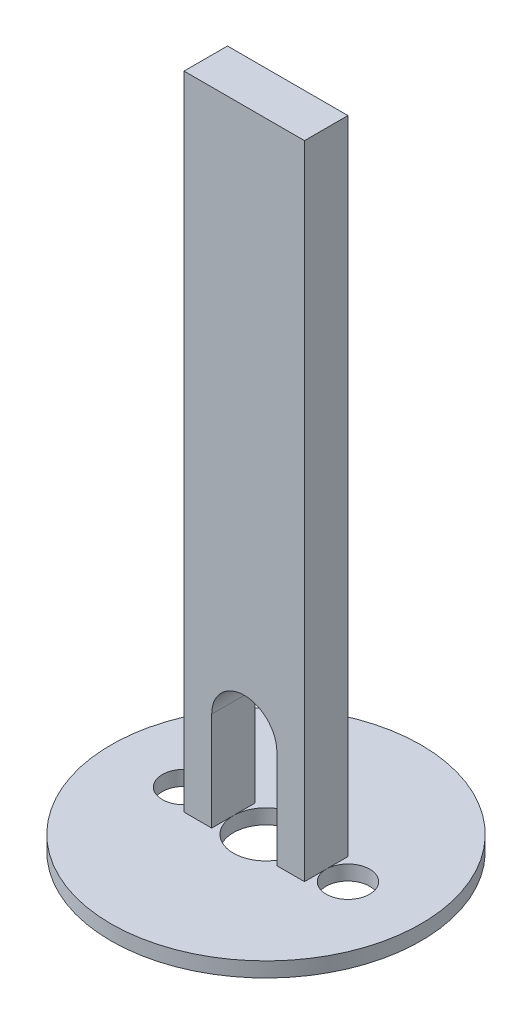
ISO-10303-21;
HEADER;
FILE_DESCRIPTION(('STEP AP214'),'2;1');
FILE_NAME('part.step','',(''),(''),'','','');
FILE_SCHEMA(('AUTOMOTIVE_DESIGN { 1 0 10303 214 1 1 1 1 }'));
ENDSEC;
DATA;
#1=APPLICATION_CONTEXT('core data for automotive mechanical design processes');
#2=APPLICATION_PROTOCOL_DEFINITION('international standard','automotive_design',2000,#1);
#3=PRODUCT_CONTEXT('',#1,'mechanical');
#4=PRODUCT('Part','Part','',(#3));
#5=PRODUCT_RELATED_PRODUCT_CATEGORY('part','',(#4));
#6=PRODUCT_DEFINITION_FORMATION('','',#4);
#7=PRODUCT_DEFINITION_CONTEXT('part definition',#1,'design');
#8=PRODUCT_DEFINITION('design','',#6,#7);
#9=PRODUCT_DEFINITION_SHAPE('','',#8);
#10=(LENGTH_UNIT() NAMED_UNIT(*) SI_UNIT(.MILLI.,.METRE.));
#11=(NAMED_UNIT(*) PLANE_ANGLE_UNIT() SI_UNIT($,.RADIAN.));
#12=(NAMED_UNIT(*) SI_UNIT($,.STERADIAN.) SOLID_ANGLE_UNIT());
#13=UNCERTAINTY_MEASURE_WITH_UNIT(LENGTH_MEASURE(1.E-05),#10,'distance_accuracy_value','');
#14=(GEOMETRIC_REPRESENTATION_CONTEXT(3) GLOBAL_UNCERTAINTY_ASSIGNED_CONTEXT((#13)) GLOBAL_UNIT_ASSIGNED_CONTEXT((#10,
#11,#12)) REPRESENTATION_CONTEXT('',''));
#15=CARTESIAN_POINT('',(0.,0.,0.));
#16=DIRECTION('',(0.,0.,1.));
#17=DIRECTION('',(1.,0.,0.));
#18=AXIS2_PLACEMENT_3D('',#15,#16,#17);
#19=CARTESIAN_POINT('',(0.,1.5,0.));
#20=DIRECTION('',(0.,1.,0.));
#21=DIRECTION('',(0.,0.,1.));
#22=AXIS2_PLACEMENT_3D('',#19,#20,#21);
#23=PLANE('',#22);
#24=DIRECTION('',(-1.,0.,0.));
#25=VECTOR('',#24,1.);
#26=CARTESIAN_POINT('',(-6.1,1.5,-2.2));
#27=LINE('',#26,#25);
#28=CARTESIAN_POINT('',(-3.3,1.5,-2.2));
#29=VERTEX_POINT('',#28);
#30=CARTESIAN_POINT('',(-6.1,1.5,-2.2));
#31=VERTEX_POINT('',#30);
#32=EDGE_CURVE('E149',#29,#31,#27,.T.);
#33=ORIENTED_EDGE('',*,*,#32,.F.);
#34=DIRECTION('',(0.,0.,-1.));
#35=VECTOR('',#34,1.);
#36=CARTESIAN_POINT('',(-3.3,1.5,15.7));
#37=LINE('',#36,#35);
#38=CARTESIAN_POINT('',(-3.3,1.5,0.));
#39=VERTEX_POINT('',#38);
#40=EDGE_CURVE('E120',#39,#29,#37,.T.);
#41=ORIENTED_EDGE('',*,*,#40,.F.);
#42=CARTESIAN_POINT('',(0.,1.5,0.));
#43=DIRECTION('',(0.,1.,0.));
#44=DIRECTION('',(0.,0.,1.));
#45=AXIS2_PLACEMENT_3D('',#42,#43,#44);
#46=CIRCLE('',#45,3.3);
#47=CARTESIAN_POINT('',(3.3,1.5,0.));
#48=VERTEX_POINT('',#47);
#49=EDGE_CURVE('E115',#48,#39,#46,.T.);
#50=ORIENTED_EDGE('',*,*,#49,.F.);
#51=DIRECTION('',(0.,0.,-1.));
#52=VECTOR('',#51,1.);
#53=CARTESIAN_POINT('',(3.3,1.5,15.7));
#54=LINE('',#53,#52);
#55=CARTESIAN_POINT('',(3.3,1.5,-2.2));
#56=VERTEX_POINT('',#55);
#57=EDGE_CURVE('E118',#48,#56,#54,.T.);
#58=ORIENTED_EDGE('',*,*,#57,.T.);
#59=CARTESIAN_POINT('',(6.1,1.5,-2.2));
#60=VERTEX_POINT('',#59);
#61=EDGE_CURVE('E188',#60,#56,#27,.T.);
#62=ORIENTED_EDGE('',*,*,#61,.F.);
#63=DIRECTION('',(0.,0.,-1.));
#64=VECTOR('',#63,1.);
#65=CARTESIAN_POINT('',(6.1,1.5,2.2));
#66=LINE('',#65,#64);
#67=CARTESIAN_POINT('',(6.1,1.5,0.));
#68=VERTEX_POINT('',#67);
#69=EDGE_CURVE('E189',#68,#60,#66,.T.);
#70=ORIENTED_EDGE('',*,*,#69,.F.);
#71=CARTESIAN_POINT('',(8.3,1.5,0.));
#72=DIRECTION('',(0.,1.,0.));
#73=DIRECTION('',(0.,0.,1.));
#74=AXIS2_PLACEMENT_3D('',#71,#72,#73);
#75=CIRCLE('',#74,2.2);
#76=EDGE_CURVE('E208',#68,#68,#75,.T.);
#77=ORIENTED_EDGE('',*,*,#76,.F.);
#78=CARTESIAN_POINT('',(6.1,1.5,2.2));
#79=VERTEX_POINT('',#78);
#80=EDGE_CURVE('E174',#79,#68,#66,.T.);
#81=ORIENTED_EDGE('',*,*,#80,.F.);
#82=DIRECTION('',(1.,0.,0.));
#83=VECTOR('',#82,1.);
#84=CARTESIAN_POINT('',(-6.1,1.5,2.2));
#85=LINE('',#84,#83);
#86=CARTESIAN_POINT('',(3.3,1.5,2.2));
#87=VERTEX_POINT('',#86);
#88=EDGE_CURVE('E58',#87,#79,#85,.T.);
#89=ORIENTED_EDGE('',*,*,#88,.F.);
#90=EDGE_CURVE('E51',#87,#48,#54,.T.);
#91=ORIENTED_EDGE('',*,*,#90,.T.);
#92=EDGE_CURVE('E125',#39,#48,#46,.T.);
#93=ORIENTED_EDGE('',*,*,#92,.F.);
#94=CARTESIAN_POINT('',(-3.3,1.5,2.2));
#95=VERTEX_POINT('',#94);
#96=EDGE_CURVE('E166',#95,#39,#37,.T.);
#97=ORIENTED_EDGE('',*,*,#96,.F.);
#98=CARTESIAN_POINT('',(-6.1,1.5,2.2));
#99=VERTEX_POINT('',#98);
#100=EDGE_CURVE('E179',#99,#95,#85,.T.);
#101=ORIENTED_EDGE('',*,*,#100,.F.);
#102=DIRECTION('',(0.,0.,1.));
#103=VECTOR('',#102,1.);
#104=CARTESIAN_POINT('',(-6.1,1.5,2.2));
#105=LINE('',#104,#103);
#106=CARTESIAN_POINT('',(-6.1,1.5,0.));
#107=VERTEX_POINT('',#106);
#108=EDGE_CURVE('E194',#107,#99,#105,.T.);
#109=ORIENTED_EDGE('',*,*,#108,.F.);
#110=CARTESIAN_POINT('',(-8.3,1.5,0.));
#111=DIRECTION('',(0.,1.,0.));
#112=DIRECTION('',(0.,0.,1.));
#113=AXIS2_PLACEMENT_3D('',#110,#111,#112);
#114=CIRCLE('',#113,2.2);
#115=EDGE_CURVE('E147',#107,#107,#114,.T.);
#116=ORIENTED_EDGE('',*,*,#115,.F.);
#117=EDGE_CURVE('E191',#31,#107,#105,.T.);
#118=ORIENTED_EDGE('',*,*,#117,.F.);
#119=EDGE_LOOP('',(#33,#41,#50,#58,#62,#70,#77,#81,#89,#91,#93,#97,#101,#109,#116,#118));
#120=FACE_BOUND('',#119,.T.);
#121=CARTESIAN_POINT('',(0.,1.5,0.));
#122=DIRECTION('',(0.,1.,0.));
#123=DIRECTION('',(0.,0.,1.));
#124=AXIS2_PLACEMENT_3D('',#121,#122,#123);
#125=CIRCLE('',#124,15.7);
#126=CARTESIAN_POINT('',(0.,1.5,15.7));
#127=VERTEX_POINT('',#126);
#128=EDGE_CURVE('E139',#127,#127,#125,.T.);
#129=ORIENTED_EDGE('',*,*,#128,.T.);
#130=EDGE_LOOP('',(#129));
#131=FACE_BOUND('',#130,.T.);
#132=ADVANCED_FACE('F36',(#120,#131),#23,.T.);
#133=CARTESIAN_POINT('',(0.,0.,0.));
#134=DIRECTION('',(0.,1.,0.));
#135=DIRECTION('',(0.,0.,1.));
#136=AXIS2_PLACEMENT_3D('',#133,#134,#135);
#137=PLANE('',#136);
#138=CARTESIAN_POINT('',(0.,0.,0.));
#139=DIRECTION('',(0.,1.,0.));
#140=DIRECTION('',(0.,0.,1.));
#141=AXIS2_PLACEMENT_3D('',#138,#139,#140);
#142=CIRCLE('',#141,15.7);
#143=CARTESIAN_POINT('',(0.,0.,15.7));
#144=VERTEX_POINT('',#143);
#145=EDGE_CURVE('E137',#144,#144,#142,.T.);
#146=ORIENTED_EDGE('',*,*,#145,.F.);
#147=EDGE_LOOP('',(#146));
#148=FACE_BOUND('',#147,.T.);
#149=CARTESIAN_POINT('',(0.,0.,0.));
#150=DIRECTION('',(0.,1.,0.));
#151=DIRECTION('',(0.,0.,1.));
#152=AXIS2_PLACEMENT_3D('',#149,#150,#151);
#153=CIRCLE('',#152,3.3);
#154=CARTESIAN_POINT('',(0.,0.,3.3));
#155=VERTEX_POINT('',#154);
#156=EDGE_CURVE('E126',#155,#155,#153,.T.);
#157=ORIENTED_EDGE('',*,*,#156,.T.);
#158=EDGE_LOOP('',(#157));
#159=FACE_BOUND('',#158,.T.);
#160=CARTESIAN_POINT('',(-8.3,0.,0.));
#161=DIRECTION('',(0.,1.,0.));
#162=DIRECTION('',(0.,0.,1.));
#163=AXIS2_PLACEMENT_3D('',#160,#161,#162);
#164=CIRCLE('',#163,2.2);
#165=CARTESIAN_POINT('',(-8.3,0.,2.2));
#166=VERTEX_POINT('',#165);
#167=EDGE_CURVE('E143',#166,#166,#164,.T.);
#168=ORIENTED_EDGE('',*,*,#167,.T.);
#169=EDGE_LOOP('',(#168));
#170=FACE_BOUND('',#169,.T.);
#171=CARTESIAN_POINT('',(8.3,0.,0.));
#172=DIRECTION('',(0.,1.,0.));
#173=DIRECTION('',(0.,0.,1.));
#174=AXIS2_PLACEMENT_3D('',#171,#172,#173);
#175=CIRCLE('',#174,2.2);
#176=CARTESIAN_POINT('',(8.3,0.,2.2));
#177=VERTEX_POINT('',#176);
#178=EDGE_CURVE('E207',#177,#177,#175,.T.);
#179=ORIENTED_EDGE('',*,*,#178,.T.);
#180=EDGE_LOOP('',(#179));
#181=FACE_BOUND('',#180,.T.);
#182=ADVANCED_FACE('F218',(#148,#159,#170,#181),#137,.F.);
#183=CARTESIAN_POINT('',(0.,1.5,0.));
#184=DIRECTION('',(0.,-1.,0.));
#185=DIRECTION('',(0.,0.,-1.));
#186=AXIS2_PLACEMENT_3D('',#183,#184,#185);
#187=CYLINDRICAL_SURFACE('',#186,15.7);
#188=ORIENTED_EDGE('',*,*,#128,.F.);
#189=EDGE_LOOP('',(#188));
#190=FACE_BOUND('',#189,.T.);
#191=ORIENTED_EDGE('',*,*,#145,.T.);
#192=EDGE_LOOP('',(#191));
#193=FACE_BOUND('',#192,.T.);
#194=ADVANCED_FACE('F38',(#190,#193),#187,.T.);
#195=CARTESIAN_POINT('',(0.,1.5,0.));
#196=DIRECTION('',(0.,-1.,0.));
#197=DIRECTION('',(0.,0.,-1.));
#198=AXIS2_PLACEMENT_3D('',#195,#196,#197);
#199=CYLINDRICAL_SURFACE('',#198,3.3);
#200=ORIENTED_EDGE('',*,*,#92,.T.);
#201=ORIENTED_EDGE('',*,*,#49,.T.);
#202=EDGE_LOOP('',(#200,#201));
#203=FACE_BOUND('',#202,.T.);
#204=ORIENTED_EDGE('',*,*,#156,.F.);
#205=EDGE_LOOP('',(#204));
#206=FACE_BOUND('',#205,.T.);
#207=ADVANCED_FACE('F135',(#203,#206),#199,.F.);
#208=CARTESIAN_POINT('',(-8.3,1.5,0.));
#209=DIRECTION('',(0.,-1.,0.));
#210=DIRECTION('',(0.,0.,-1.));
#211=AXIS2_PLACEMENT_3D('',#208,#209,#210);
#212=CYLINDRICAL_SURFACE('',#211,2.2);
#213=ORIENTED_EDGE('',*,*,#115,.T.);
#214=EDGE_LOOP('',(#213));
#215=FACE_BOUND('',#214,.T.);
#216=ORIENTED_EDGE('',*,*,#167,.F.);
#217=EDGE_LOOP('',(#216));
#218=FACE_BOUND('',#217,.T.);
#219=ADVANCED_FACE('F221',(#215,#218),#212,.F.);
#220=CARTESIAN_POINT('',(8.3,1.5,0.));
#221=DIRECTION('',(0.,-1.,0.));
#222=DIRECTION('',(0.,0.,-1.));
#223=AXIS2_PLACEMENT_3D('',#220,#221,#222);
#224=CYLINDRICAL_SURFACE('',#223,2.2);
#225=ORIENTED_EDGE('',*,*,#76,.T.);
#226=EDGE_LOOP('',(#225));
#227=FACE_BOUND('',#226,.T.);
#228=ORIENTED_EDGE('',*,*,#178,.F.);
#229=EDGE_LOOP('',(#228));
#230=FACE_BOUND('',#229,.T.);
#231=ADVANCED_FACE('F223',(#227,#230),#224,.F.);
#232=CARTESIAN_POINT('',(6.1,66.5,2.2));
#233=DIRECTION('',(-1.,0.,0.));
#234=DIRECTION('',(0.,0.,1.));
#235=AXIS2_PLACEMENT_3D('',#232,#233,#234);
#236=PLANE('',#235);
#237=ORIENTED_EDGE('',*,*,#80,.T.);
#238=ORIENTED_EDGE('',*,*,#69,.T.);
#239=DIRECTION('',(0.,-1.,0.));
#240=VECTOR('',#239,1.);
#241=CARTESIAN_POINT('',(6.1,66.5,-2.2));
#242=LINE('',#241,#240);
#243=CARTESIAN_POINT('',(6.1,66.5,-2.2));
#244=VERTEX_POINT('',#243);
#245=EDGE_CURVE('E204',#244,#60,#242,.T.);
#246=ORIENTED_EDGE('',*,*,#245,.F.);
#247=DIRECTION('',(0.,0.,-1.));
#248=VECTOR('',#247,1.);
#249=CARTESIAN_POINT('',(6.1,66.5,2.2));
#250=LINE('',#249,#248);
#251=CARTESIAN_POINT('',(6.1,66.5,2.2));
#252=VERTEX_POINT('',#251);
#253=EDGE_CURVE('E175',#252,#244,#250,.T.);
#254=ORIENTED_EDGE('',*,*,#253,.F.);
#255=DIRECTION('',(0.,-1.,0.));
#256=VECTOR('',#255,1.);
#257=CARTESIAN_POINT('',(6.1,66.5,2.2));
#258=LINE('',#257,#256);
#259=EDGE_CURVE('E185',#252,#79,#258,.T.);
#260=ORIENTED_EDGE('',*,*,#259,.T.);
#261=EDGE_LOOP('',(#237,#238,#246,#254,#260));
#262=FACE_BOUND('',#261,.T.);
#263=ADVANCED_FACE('F229',(#262),#236,.F.);
#264=CARTESIAN_POINT('',(-6.1,66.5,-2.2));
#265=DIRECTION('',(0.,0.,1.));
#266=DIRECTION('',(1.,0.,0.));
#267=AXIS2_PLACEMENT_3D('',#264,#265,#266);
#268=PLANE('',#267);
#269=CARTESIAN_POINT('',(0.,11.5,-2.2));
#270=DIRECTION('',(0.,0.,1.));
#271=DIRECTION('',(1.,0.,0.));
#272=AXIS2_PLACEMENT_3D('',#269,#270,#271);
#273=CIRCLE('',#272,3.3);
#274=CARTESIAN_POINT('',(3.3,11.5,-2.2));
#275=VERTEX_POINT('',#274);
#276=CARTESIAN_POINT('',(-3.3,11.5,-2.2));
#277=VERTEX_POINT('',#276);
#278=EDGE_CURVE('E172',#275,#277,#273,.T.);
#279=ORIENTED_EDGE('',*,*,#278,.T.);
#280=DIRECTION('',(0.,-1.,0.));
#281=VECTOR('',#280,1.);
#282=CARTESIAN_POINT('',(-3.3,66.5,-2.2));
#283=LINE('',#282,#281);
#284=EDGE_CURVE('E165',#277,#29,#283,.T.);
#285=ORIENTED_EDGE('',*,*,#284,.T.);
#286=ORIENTED_EDGE('',*,*,#32,.T.);
#287=DIRECTION('',(0.,-1.,0.));
#288=VECTOR('',#287,1.);
#289=CARTESIAN_POINT('',(-6.1,66.5,-2.2));
#290=LINE('',#289,#288);
#291=CARTESIAN_POINT('',(-6.1,66.5,-2.2));
#292=VERTEX_POINT('',#291);
#293=EDGE_CURVE('E201',#292,#31,#290,.T.);
#294=ORIENTED_EDGE('',*,*,#293,.F.);
#295=DIRECTION('',(-1.,0.,0.));
#296=VECTOR('',#295,1.);
#297=CARTESIAN_POINT('',(-6.1,66.5,-2.2));
#298=LINE('',#297,#296);
#299=EDGE_CURVE('E178',#244,#292,#298,.T.);
#300=ORIENTED_EDGE('',*,*,#299,.F.);
#301=ORIENTED_EDGE('',*,*,#245,.T.);
#302=ORIENTED_EDGE('',*,*,#61,.T.);
#303=DIRECTION('',(0.,1.,0.));
#304=VECTOR('',#303,1.);
#305=CARTESIAN_POINT('',(3.3,66.5,-2.2));
#306=LINE('',#305,#304);
#307=EDGE_CURVE('E131',#56,#275,#306,.T.);
#308=ORIENTED_EDGE('',*,*,#307,.T.);
#309=EDGE_LOOP('',(#279,#285,#286,#294,#300,#301,#302,#308));
#310=FACE_BOUND('',#309,.T.);
#311=ADVANCED_FACE('F260',(#310),#268,.F.);
#312=CARTESIAN_POINT('',(-6.1,66.5,2.2));
#313=DIRECTION('',(1.,0.,0.));
#314=DIRECTION('',(0.,0.,-1.));
#315=AXIS2_PLACEMENT_3D('',#312,#313,#314);
#316=PLANE('',#315);
#317=ORIENTED_EDGE('',*,*,#117,.T.);
#318=ORIENTED_EDGE('',*,*,#108,.T.);
#319=DIRECTION('',(0.,-1.,0.));
#320=VECTOR('',#319,1.);
#321=CARTESIAN_POINT('',(-6.1,66.5,2.2));
#322=LINE('',#321,#320);
#323=CARTESIAN_POINT('',(-6.1,66.5,2.2));
#324=VERTEX_POINT('',#323);
#325=EDGE_CURVE('E198',#324,#99,#322,.T.);
#326=ORIENTED_EDGE('',*,*,#325,.F.);
#327=DIRECTION('',(0.,0.,1.));
#328=VECTOR('',#327,1.);
#329=CARTESIAN_POINT('',(-6.1,66.5,2.2));
#330=LINE('',#329,#328);
#331=EDGE_CURVE('E181',#292,#324,#330,.T.);
#332=ORIENTED_EDGE('',*,*,#331,.F.);
#333=ORIENTED_EDGE('',*,*,#293,.T.);
#334=EDGE_LOOP('',(#317,#318,#326,#332,#333));
#335=FACE_BOUND('',#334,.T.);
#336=ADVANCED_FACE('F265',(#335),#316,.F.);
#337=CARTESIAN_POINT('',(-6.1,66.5,2.2));
#338=DIRECTION('',(0.,0.,-1.));
#339=DIRECTION('',(-1.,0.,0.));
#340=AXIS2_PLACEMENT_3D('',#337,#338,#339);
#341=PLANE('',#340);
#342=ORIENTED_EDGE('',*,*,#100,.T.);
#343=DIRECTION('',(0.,1.,0.));
#344=VECTOR('',#343,1.);
#345=CARTESIAN_POINT('',(-3.3,66.5,2.2));
#346=LINE('',#345,#344);
#347=CARTESIAN_POINT('',(-3.3,11.5,2.2));
#348=VERTEX_POINT('',#347);
#349=EDGE_CURVE('E11',#95,#348,#346,.T.);
#350=ORIENTED_EDGE('',*,*,#349,.T.);
#351=CARTESIAN_POINT('',(0.,11.5,2.2));
#352=DIRECTION('',(0.,0.,-1.));
#353=DIRECTION('',(-1.,0.,0.));
#354=AXIS2_PLACEMENT_3D('',#351,#352,#353);
#355=CIRCLE('',#354,3.3);
#356=CARTESIAN_POINT('',(3.3,11.5,2.2));
#357=VERTEX_POINT('',#356);
#358=EDGE_CURVE('E44',#348,#357,#355,.T.);
#359=ORIENTED_EDGE('',*,*,#358,.T.);
#360=DIRECTION('',(0.,-1.,0.));
#361=VECTOR('',#360,1.);
#362=CARTESIAN_POINT('',(3.3,66.5,2.2));
#363=LINE('',#362,#361);
#364=EDGE_CURVE('E151',#357,#87,#363,.T.);
#365=ORIENTED_EDGE('',*,*,#364,.T.);
#366=ORIENTED_EDGE('',*,*,#88,.T.);
#367=ORIENTED_EDGE('',*,*,#259,.F.);
#368=DIRECTION('',(1.,0.,0.));
#369=VECTOR('',#368,1.);
#370=CARTESIAN_POINT('',(-6.1,66.5,2.2));
#371=LINE('',#370,#369);
#372=EDGE_CURVE('E183',#324,#252,#371,.T.);
#373=ORIENTED_EDGE('',*,*,#372,.F.);
#374=ORIENTED_EDGE('',*,*,#325,.T.);
#375=EDGE_LOOP('',(#342,#350,#359,#365,#366,#367,#373,#374));
#376=FACE_BOUND('',#375,.T.);
#377=ADVANCED_FACE('F154',(#376),#341,.F.);
#378=CARTESIAN_POINT('',(0.,66.5,0.));
#379=DIRECTION('',(0.,-1.,0.));
#380=DIRECTION('',(0.,0.,-1.));
#381=AXIS2_PLACEMENT_3D('',#378,#379,#380);
#382=PLANE('',#381);
#383=ORIENTED_EDGE('',*,*,#253,.T.);
#384=ORIENTED_EDGE('',*,*,#299,.T.);
#385=ORIENTED_EDGE('',*,*,#331,.T.);
#386=ORIENTED_EDGE('',*,*,#372,.T.);
#387=EDGE_LOOP('',(#383,#384,#385,#386));
#388=FACE_BOUND('',#387,.T.);
#389=ADVANCED_FACE('F279',(#388),#382,.F.);
#390=CARTESIAN_POINT('',(0.,11.5,15.7));
#391=DIRECTION('',(0.,0.,-1.));
#392=DIRECTION('',(-1.,0.,0.));
#393=AXIS2_PLACEMENT_3D('',#390,#391,#392);
#394=CYLINDRICAL_SURFACE('',#393,3.3);
#395=DIRECTION('',(0.,0.,-1.));
#396=VECTOR('',#395,1.);
#397=CARTESIAN_POINT('',(3.3,11.5,15.7));
#398=LINE('',#397,#396);
#399=EDGE_CURVE('E132',#357,#275,#398,.T.);
#400=ORIENTED_EDGE('',*,*,#399,.F.);
#401=ORIENTED_EDGE('',*,*,#358,.F.);
#402=DIRECTION('',(0.,0.,-1.));
#403=VECTOR('',#402,1.);
#404=CARTESIAN_POINT('',(-3.3,11.5,15.7));
#405=LINE('',#404,#403);
#406=EDGE_CURVE('E160',#348,#277,#405,.T.);
#407=ORIENTED_EDGE('',*,*,#406,.T.);
#408=ORIENTED_EDGE('',*,*,#278,.F.);
#409=EDGE_LOOP('',(#400,#401,#407,#408));
#410=FACE_BOUND('',#409,.T.);
#411=ADVANCED_FACE('F159',(#410),#394,.F.);
#412=CARTESIAN_POINT('',(-3.3,0.,15.7));
#413=DIRECTION('',(-1.,0.,0.));
#414=DIRECTION('',(0.,-1.,0.));
#415=AXIS2_PLACEMENT_3D('',#412,#413,#414);
#416=PLANE('',#415);
#417=ORIENTED_EDGE('',*,*,#406,.F.);
#418=ORIENTED_EDGE('',*,*,#349,.F.);
#419=ORIENTED_EDGE('',*,*,#96,.T.);
#420=ORIENTED_EDGE('',*,*,#40,.T.);
#421=ORIENTED_EDGE('',*,*,#284,.F.);
#422=EDGE_LOOP('',(#417,#418,#419,#420,#421));
#423=FACE_BOUND('',#422,.T.);
#424=ADVANCED_FACE('F163',(#423),#416,.F.);
#425=CARTESIAN_POINT('',(3.3,0.,15.7));
#426=DIRECTION('',(1.,0.,0.));
#427=DIRECTION('',(0.,1.,0.));
#428=AXIS2_PLACEMENT_3D('',#425,#426,#427);
#429=PLANE('',#428);
#430=ORIENTED_EDGE('',*,*,#57,.F.);
#431=ORIENTED_EDGE('',*,*,#90,.F.);
#432=ORIENTED_EDGE('',*,*,#364,.F.);
#433=ORIENTED_EDGE('',*,*,#399,.T.);
#434=ORIENTED_EDGE('',*,*,#307,.F.);
#435=EDGE_LOOP('',(#430,#431,#432,#433,#434));
#436=FACE_BOUND('',#435,.T.);
#437=ADVANCED_FACE('F128',(#436),#429,.F.);
#438=CLOSED_SHELL('',(#132,#182,#194,#207,#219,#231,#263,#311,#336,#377,#389,#411,#424,#437));
#439=MANIFOLD_SOLID_BREP('B2',#438);
#440=ADVANCED_BREP_SHAPE_REPRESENTATION('',(#18,#439),#14);
#441=SHAPE_DEFINITION_REPRESENTATION(#9,#440);
ENDSEC;
END-ISO-10303-21;
